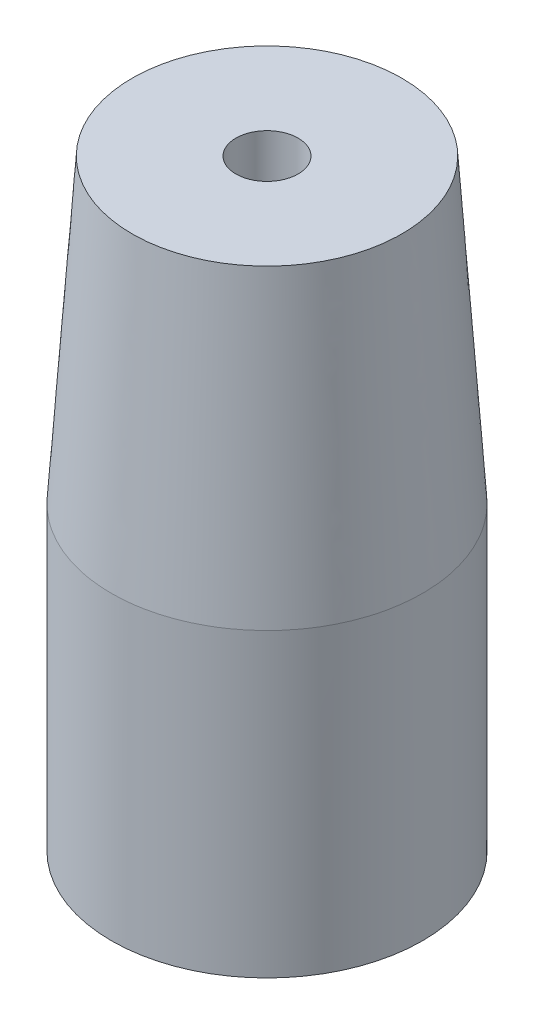
ISO-10303-21;
HEADER;
FILE_DESCRIPTION(('STEP AP214'),'2;1');
FILE_NAME('part.step','',(''),(''),'','','');
FILE_SCHEMA(('AUTOMOTIVE_DESIGN { 1 0 10303 214 1 1 1 1 }'));
ENDSEC;
DATA;
#1=APPLICATION_CONTEXT('core data for automotive mechanical design processes');
#2=APPLICATION_PROTOCOL_DEFINITION('international standard','automotive_design',2000,#1);
#3=PRODUCT_CONTEXT('',#1,'mechanical');
#4=PRODUCT('Part','Part','',(#3));
#5=PRODUCT_RELATED_PRODUCT_CATEGORY('part','',(#4));
#6=PRODUCT_DEFINITION_FORMATION('','',#4);
#7=PRODUCT_DEFINITION_CONTEXT('part definition',#1,'design');
#8=PRODUCT_DEFINITION('design','',#6,#7);
#9=PRODUCT_DEFINITION_SHAPE('','',#8);
#10=(LENGTH_UNIT() NAMED_UNIT(*) SI_UNIT(.MILLI.,.METRE.));
#11=(NAMED_UNIT(*) PLANE_ANGLE_UNIT() SI_UNIT($,.RADIAN.));
#12=(NAMED_UNIT(*) SI_UNIT($,.STERADIAN.) SOLID_ANGLE_UNIT());
#13=UNCERTAINTY_MEASURE_WITH_UNIT(LENGTH_MEASURE(1.E-05),#10,'distance_accuracy_value','');
#14=(GEOMETRIC_REPRESENTATION_CONTEXT(3) GLOBAL_UNCERTAINTY_ASSIGNED_CONTEXT((#13)) GLOBAL_UNIT_ASSIGNED_CONTEXT((#10,
#11,#12)) REPRESENTATION_CONTEXT('',''));
#15=CARTESIAN_POINT('',(0.,0.,0.));
#16=DIRECTION('',(0.,0.,1.));
#17=DIRECTION('',(1.,0.,0.));
#18=AXIS2_PLACEMENT_3D('',#15,#16,#17);
#19=CARTESIAN_POINT('',(0.,58.,-13.));
#20=CARTESIAN_POINT('',(-1.70169601901627,58.,-13.));
#21=CARTESIAN_POINT('',(-3.40272249822104,58.,-12.6616447960457));
#22=CARTESIAN_POINT('',(-6.54704674327126,58.,-11.3592230492478));
#23=CARTESIAN_POINT('',(-7.98910736086065,58.,-10.3956689499896));
#24=CARTESIAN_POINT('',(-10.3956689499896,58.,-7.98910736086063));
#25=CARTESIAN_POINT('',(-11.3592230492496,58.,-6.54704674326676));
#26=CARTESIAN_POINT('',(-12.6616447960438,58.,-3.40272249822562));
#27=CARTESIAN_POINT('',(-13.,58.,-1.70169601901135));
#28=CARTESIAN_POINT('',(-13.,58.,1.70169601901137));
#29=CARTESIAN_POINT('',(-12.6616447960482,58.,3.40272249821674));
#30=CARTESIAN_POINT('',(-11.3592230492452,58.,6.5470467432756));
#31=CARTESIAN_POINT('',(-10.3956689499861,58.,7.9891073608656));
#32=CARTESIAN_POINT('',(-7.98910736086411,58.,10.3956689499847));
#33=CARTESIAN_POINT('',(-6.54704674327559,58.,11.3592230492467));
#34=CARTESIAN_POINT('',(-3.40272249821674,58.,12.6616447960468));
#35=CARTESIAN_POINT('',(-1.70169601902153,58.,13.));
#36=CARTESIAN_POINT('',(1.70169601902153,58.,13.));
#37=CARTESIAN_POINT('',(3.40272249822191,58.,12.6616447960453));
#38=CARTESIAN_POINT('',(6.54704674327043,58.,11.3592230492482));
#39=CARTESIAN_POINT('',(7.98910736085969,58.,10.3956689499891));
#40=CARTESIAN_POINT('',(10.3956689499906,58.,7.98910736086116));
#41=CARTESIAN_POINT('',(11.3592230492482,58.,6.54704674327116));
#42=CARTESIAN_POINT('',(12.6616447960453,58.,3.40272249822116));
#43=CARTESIAN_POINT('',(13.,58.,1.70169601901627));
#44=CARTESIAN_POINT('',(13.,58.,-1.70169601901627));
#45=CARTESIAN_POINT('',(12.6616447960468,58.,-3.40272249822117));
#46=CARTESIAN_POINT('',(11.3592230492467,58.,-6.54704674327117));
#47=CARTESIAN_POINT('',(10.3956689499896,58.,-7.98910736085917));
#48=CARTESIAN_POINT('',(7.98910736086063,58.,-10.3956689499911));
#49=CARTESIAN_POINT('',(6.54704674327129,58.,-11.3592230492492));
#50=CARTESIAN_POINT('',(3.40272249822108,58.,-12.6616447960442));
#51=CARTESIAN_POINT('',(1.70169601901627,58.,-13.));
#52=CARTESIAN_POINT('',(0.,58.,-13.));
#53=CARTESIAN_POINT('',(0.,29.,-15.));
#54=CARTESIAN_POINT('',(-1.96349540655723,29.,-15.));
#55=CARTESIAN_POINT('',(-3.92621826717803,29.,-14.6095901492838));
#56=CARTESIAN_POINT('',(-7.55428470377462,29.,-13.1067958260548));
#57=CARTESIAN_POINT('',(-9.21820080099237,29.,-11.9950026346041));
#58=CARTESIAN_POINT('',(-11.9950026346041,29.,-9.21820080099236));
#59=CARTESIAN_POINT('',(-13.106795826057,29.,-7.55428470376942));
#60=CARTESIAN_POINT('',(-14.6095901492816,29.,-3.92621826718332));
#61=CARTESIAN_POINT('',(-15.,29.,-1.96349540655156));
#62=CARTESIAN_POINT('',(-15.,29.,1.96349540655158));
#63=CARTESIAN_POINT('',(-14.6095901492859,29.,3.92621826717291));
#64=CARTESIAN_POINT('',(-13.1067958260527,29.,7.55428470377979));
#65=CARTESIAN_POINT('',(-11.9950026345986,29.,9.21820080099786));
#66=CARTESIAN_POINT('',(-9.21820080099784,29.,11.9950026345986));
#67=CARTESIAN_POINT('',(-7.55428470377926,29.,13.1067958260529));
#68=CARTESIAN_POINT('',(-3.92621826717343,29.,14.6095901492857));
#69=CARTESIAN_POINT('',(-1.96349540656331,29.,15.));
#70=CARTESIAN_POINT('',(1.96349540656331,29.,15.));
#71=CARTESIAN_POINT('',(3.92621826717951,29.,14.6095901492832));
#72=CARTESIAN_POINT('',(7.55428470377318,29.,13.1067958260554));
#73=CARTESIAN_POINT('',(9.21820080099269,29.,11.9950026346037));
#74=CARTESIAN_POINT('',(11.9950026346037,29.,9.21820080099269));
#75=CARTESIAN_POINT('',(13.106795826055,29.,7.55428470377433));
#76=CARTESIAN_POINT('',(14.6095901492836,29.,3.92621826717836));
#77=CARTESIAN_POINT('',(15.,29.,1.96349540655724));
#78=CARTESIAN_POINT('',(15.,29.,-1.96349540655723));
#79=CARTESIAN_POINT('',(14.6095901492839,29.,-3.92621826717784));
#80=CARTESIAN_POINT('',(13.1067958260547,29.,-7.55428470377486));
#81=CARTESIAN_POINT('',(11.9950026346048,29.,-9.21820080099164));
#82=CARTESIAN_POINT('',(9.21820080099162,29.,-11.9950026346048));
#83=CARTESIAN_POINT('',(7.55428470377414,29.,-13.106795826055));
#84=CARTESIAN_POINT('',(3.9262182671786,29.,-14.6095901492835));
#85=CARTESIAN_POINT('',(1.96349540655724,29.,-15.));
#86=CARTESIAN_POINT('',(0.,29.,-15.));
#87=B_SPLINE_SURFACE_WITH_KNOTS('',1,3,((#19,#20,#21,#22,#23,#24,#25,#26,#27,#28,#29,#30,#31,
#32,#33,#34,#35,#36,#37,#38,#39,#40,#41,#42,#43,#44,#45,#46,#47,#48,#49,#50,#51,#52),(#53,#54,
#55,#56,#57,#58,#59,#60,#61,#62,#63,#64,#65,#66,#67,#68,#69,#70,#71,#72,#73,#74,#75,#76,#77,#78,
#79,#80,#81,#82,#83,#84,#85,#86)),.UNSPECIFIED.,.F.,.T.,.F.,(2,2),(4,2,2,2,2,2,2,2,2,2,2,2,2,2,
2,2,4),(0.,1.),(-3.14159265358979,-2.74889357189107,-2.35619449019234,-1.96349540849362,
-1.5707963267949,-1.17809724509617,-0.785398163397448,-0.392699081698724,0.,0.392699081698724,
0.785398163397448,1.17809724509617,1.5707963267949,1.96349540849362,2.35619449019234,
2.74889357189107,3.14159265358979),.UNSPECIFIED.);
#88=CARTESIAN_POINT('',(0.,58.,-13.));
#89=CARTESIAN_POINT('',(1.70169601901627,58.,-13.));
#90=CARTESIAN_POINT('',(3.40272249822108,58.,-12.6616447960442));
#91=CARTESIAN_POINT('',(6.54704674327129,58.,-11.3592230492492));
#92=CARTESIAN_POINT('',(7.98910736086063,58.,-10.3956689499911));
#93=CARTESIAN_POINT('',(10.3956689499896,58.,-7.98910736085917));
#94=CARTESIAN_POINT('',(11.3592230492467,58.,-6.54704674327117));
#95=CARTESIAN_POINT('',(12.6616447960468,58.,-3.40272249822117));
#96=CARTESIAN_POINT('',(13.,58.,-1.70169601901627));
#97=CARTESIAN_POINT('',(13.,58.,1.70169601901627));
#98=CARTESIAN_POINT('',(12.6616447960453,58.,3.40272249822116));
#99=CARTESIAN_POINT('',(11.3592230492482,58.,6.54704674327116));
#100=CARTESIAN_POINT('',(10.3956689499906,58.,7.98910736086116));
#101=CARTESIAN_POINT('',(7.98910736085969,58.,10.3956689499891));
#102=CARTESIAN_POINT('',(6.54704674327043,58.,11.3592230492482));
#103=CARTESIAN_POINT('',(3.40272249822191,58.,12.6616447960453));
#104=CARTESIAN_POINT('',(1.70169601902153,58.,13.));
#105=CARTESIAN_POINT('',(-1.70169601902153,58.,13.));
#106=CARTESIAN_POINT('',(-3.40272249821674,58.,12.6616447960468));
#107=CARTESIAN_POINT('',(-6.54704674327559,58.,11.3592230492467));
#108=CARTESIAN_POINT('',(-7.98910736086411,58.,10.3956689499847));
#109=CARTESIAN_POINT('',(-10.3956689499861,58.,7.9891073608656));
#110=CARTESIAN_POINT('',(-11.3592230492452,58.,6.5470467432756));
#111=CARTESIAN_POINT('',(-12.6616447960482,58.,3.40272249821674));
#112=CARTESIAN_POINT('',(-13.,58.,1.70169601901137));
#113=CARTESIAN_POINT('',(-13.,58.,-1.70169601901135));
#114=CARTESIAN_POINT('',(-12.6616447960438,58.,-3.40272249822562));
#115=CARTESIAN_POINT('',(-11.3592230492496,58.,-6.54704674326676));
#116=CARTESIAN_POINT('',(-10.3956689499896,58.,-7.98910736086063));
#117=CARTESIAN_POINT('',(-7.98910736086065,58.,-10.3956689499896));
#118=CARTESIAN_POINT('',(-6.54704674327126,58.,-11.3592230492478));
#119=CARTESIAN_POINT('',(-3.40272249822104,58.,-12.6616447960457));
#120=CARTESIAN_POINT('',(-1.70169601901627,58.,-13.));
#121=CARTESIAN_POINT('',(0.,58.,-13.));
#122=B_SPLINE_CURVE_WITH_KNOTS('',3,(#88,#89,#90,#91,#92,#93,#94,#95,#96,#97,#98,#99,#100,#101,
#102,#103,#104,#105,#106,#107,#108,#109,#110,#111,#112,#113,#114,#115,#116,#117,#118,#119,#120,
#121),.UNSPECIFIED.,.T.,.F.,(4,2,2,2,2,2,2,2,2,2,2,2,2,2,2,2,4),(-3.14159265358979,
-2.74889357189107,-2.35619449019234,-1.96349540849362,-1.5707963267949,-1.17809724509617,
-0.785398163397448,-0.392699081698724,0.,0.392699081698724,0.785398163397448,1.17809724509617,
1.5707963267949,1.96349540849362,2.35619449019234,2.74889357189107,3.14159265358979),.UNSPECIFIED.);
#123=CARTESIAN_POINT('',(0.,58.,-13.));
#124=VERTEX_POINT('',#123);
#125=EDGE_CURVE('E47',#124,#124,#122,.F.);
#126=CARTESIAN_POINT('',(0.,29.,-15.));
#127=CARTESIAN_POINT('',(-1.96349540655723,29.,-15.));
#128=CARTESIAN_POINT('',(-3.92621826717803,29.,-14.6095901492838));
#129=CARTESIAN_POINT('',(-7.55428470377462,29.,-13.1067958260548));
#130=CARTESIAN_POINT('',(-9.21820080099237,29.,-11.9950026346041));
#131=CARTESIAN_POINT('',(-11.9950026346041,29.,-9.21820080099236));
#132=CARTESIAN_POINT('',(-13.106795826057,29.,-7.55428470376942));
#133=CARTESIAN_POINT('',(-14.6095901492816,29.,-3.92621826718332));
#134=CARTESIAN_POINT('',(-15.,29.,-1.96349540655156));
#135=CARTESIAN_POINT('',(-15.,29.,1.96349540655158));
#136=CARTESIAN_POINT('',(-14.6095901492859,29.,3.92621826717291));
#137=CARTESIAN_POINT('',(-13.1067958260527,29.,7.55428470377979));
#138=CARTESIAN_POINT('',(-11.9950026345986,29.,9.21820080099786));
#139=CARTESIAN_POINT('',(-9.21820080099784,29.,11.9950026345986));
#140=CARTESIAN_POINT('',(-7.55428470377926,29.,13.1067958260529));
#141=CARTESIAN_POINT('',(-3.92621826717343,29.,14.6095901492857));
#142=CARTESIAN_POINT('',(-1.96349540656331,29.,15.));
#143=CARTESIAN_POINT('',(1.96349540656331,29.,15.));
#144=CARTESIAN_POINT('',(3.92621826717951,29.,14.6095901492832));
#145=CARTESIAN_POINT('',(7.55428470377318,29.,13.1067958260554));
#146=CARTESIAN_POINT('',(9.21820080099269,29.,11.9950026346037));
#147=CARTESIAN_POINT('',(11.9950026346037,29.,9.21820080099269));
#148=CARTESIAN_POINT('',(13.106795826055,29.,7.55428470377433));
#149=CARTESIAN_POINT('',(14.6095901492836,29.,3.92621826717836));
#150=CARTESIAN_POINT('',(15.,29.,1.96349540655724));
#151=CARTESIAN_POINT('',(15.,29.,-1.96349540655723));
#152=CARTESIAN_POINT('',(14.6095901492839,29.,-3.92621826717784));
#153=CARTESIAN_POINT('',(13.1067958260547,29.,-7.55428470377486));
#154=CARTESIAN_POINT('',(11.9950026346048,29.,-9.21820080099164));
#155=CARTESIAN_POINT('',(9.21820080099162,29.,-11.9950026346048));
#156=CARTESIAN_POINT('',(7.55428470377414,29.,-13.106795826055));
#157=CARTESIAN_POINT('',(3.9262182671786,29.,-14.6095901492835));
#158=CARTESIAN_POINT('',(1.96349540655724,29.,-15.));
#159=CARTESIAN_POINT('',(0.,29.,-15.));
#160=B_SPLINE_CURVE_WITH_KNOTS('',3,(#126,#127,#128,#129,#130,#131,#132,#133,#134,#135,#136,
#137,#138,#139,#140,#141,#142,#143,#144,#145,#146,#147,#148,#149,#150,#151,#152,#153,#154,#155,
#156,#157,#158,#159),.UNSPECIFIED.,.T.,.F.,(4,2,2,2,2,2,2,2,2,2,2,2,2,2,2,2,4),
(-3.14159265358979,-2.74889357189107,-2.35619449019234,-1.96349540849362,-1.5707963267949,
-1.17809724509617,-0.785398163397448,-0.392699081698724,0.,0.392699081698724,0.785398163397448,
1.17809724509617,1.5707963267949,1.96349540849362,2.35619449019234,2.74889357189107,
3.14159265358979),.UNSPECIFIED.);
#161=CARTESIAN_POINT('',(0.,29.,-15.));
#162=VERTEX_POINT('',#161);
#163=EDGE_CURVE('E12',#162,#162,#160,.F.);
#164=ORIENTED_EDGE('',*,*,#125,.F.);
#165=EDGE_LOOP('',(#164));
#166=FACE_BOUND('',#165,.T.);
#167=ORIENTED_EDGE('',*,*,#163,.F.);
#168=EDGE_LOOP('',(#167));
#169=FACE_BOUND('',#168,.T.);
#170=ADVANCED_FACE('F36',(#166,#169),#87,.T.);
#171=CARTESIAN_POINT('',(0.,58.,0.));
#172=DIRECTION('',(0.,-1.,0.));
#173=DIRECTION('',(0.,0.,-1.));
#174=AXIS2_PLACEMENT_3D('',#171,#172,#173);
#175=CYLINDRICAL_SURFACE('',#174,15.);
#176=ORIENTED_EDGE('',*,*,#163,.T.);
#177=EDGE_LOOP('',(#176));
#178=FACE_BOUND('',#177,.T.);
#179=CARTESIAN_POINT('',(0.,0.,0.));
#180=DIRECTION('',(0.,1.,0.));
#181=DIRECTION('',(0.,0.,1.));
#182=AXIS2_PLACEMENT_3D('',#179,#180,#181);
#183=CIRCLE('',#182,15.);
#184=CARTESIAN_POINT('',(0.,0.,15.));
#185=VERTEX_POINT('',#184);
#186=EDGE_CURVE('E52',#185,#185,#183,.T.);
#187=ORIENTED_EDGE('',*,*,#186,.T.);
#188=EDGE_LOOP('',(#187));
#189=FACE_BOUND('',#188,.T.);
#190=ADVANCED_FACE('F81',(#178,#189),#175,.T.);
#191=CARTESIAN_POINT('',(0.,58.,0.));
#192=DIRECTION('',(0.,1.,0.));
#193=DIRECTION('',(0.,0.,1.));
#194=AXIS2_PLACEMENT_3D('',#191,#192,#193);
#195=PLANE('',#194);
#196=CARTESIAN_POINT('',(0.,58.,0.));
#197=DIRECTION('',(0.,1.,0.));
#198=DIRECTION('',(0.,0.,1.));
#199=AXIS2_PLACEMENT_3D('',#196,#197,#198);
#200=CIRCLE('',#199,3.);
#201=CARTESIAN_POINT('',(0.,58.,3.));
#202=VERTEX_POINT('',#201);
#203=EDGE_CURVE('E62',#202,#202,#200,.T.);
#204=ORIENTED_EDGE('',*,*,#203,.F.);
#205=EDGE_LOOP('',(#204));
#206=FACE_BOUND('',#205,.T.);
#207=ORIENTED_EDGE('',*,*,#125,.T.);
#208=EDGE_LOOP('',(#207));
#209=FACE_BOUND('',#208,.T.);
#210=ADVANCED_FACE('F70',(#206,#209),#195,.T.);
#211=CARTESIAN_POINT('',(0.,0.,0.));
#212=DIRECTION('',(0.,1.,0.));
#213=DIRECTION('',(0.,0.,1.));
#214=AXIS2_PLACEMENT_3D('',#211,#212,#213);
#215=PLANE('',#214);
#216=CARTESIAN_POINT('',(0.,0.,0.));
#217=DIRECTION('',(0.,1.,0.));
#218=DIRECTION('',(0.,0.,1.));
#219=AXIS2_PLACEMENT_3D('',#216,#217,#218);
#220=CIRCLE('',#219,3.);
#221=CARTESIAN_POINT('',(0.,0.,3.));
#222=VERTEX_POINT('',#221);
#223=EDGE_CURVE('E57',#222,#222,#220,.T.);
#224=ORIENTED_EDGE('',*,*,#223,.T.);
#225=EDGE_LOOP('',(#224));
#226=FACE_BOUND('',#225,.T.);
#227=ORIENTED_EDGE('',*,*,#186,.F.);
#228=EDGE_LOOP('',(#227));
#229=FACE_BOUND('',#228,.T.);
#230=ADVANCED_FACE('F80',(#226,#229),#215,.F.);
#231=CARTESIAN_POINT('',(0.,0.,0.));
#232=DIRECTION('',(0.,1.,0.));
#233=DIRECTION('',(0.,0.,1.));
#234=AXIS2_PLACEMENT_3D('',#231,#232,#233);
#235=CYLINDRICAL_SURFACE('',#234,3.);
#236=CARTESIAN_POINT('',(0.,0.,3.));
#237=CARTESIAN_POINT('',(0.,0.604166666666666,3.));
#238=CARTESIAN_POINT('',(0.,1.20833333333333,3.));
#239=CARTESIAN_POINT('',(0.,2.41666666666667,3.));
#240=CARTESIAN_POINT('',(0.,3.02083333333333,3.));
#241=CARTESIAN_POINT('',(0.,4.22916666666667,3.));
#242=CARTESIAN_POINT('',(0.,4.83333333333333,3.));
#243=CARTESIAN_POINT('',(0.,6.04166666666667,3.));
#244=CARTESIAN_POINT('',(0.,6.64583333333333,3.));
#245=CARTESIAN_POINT('',(0.,7.85416666666667,3.));
#246=CARTESIAN_POINT('',(0.,8.45833333333333,3.));
#247=CARTESIAN_POINT('',(0.,9.66666666666667,3.));
#248=CARTESIAN_POINT('',(0.,10.2708333333333,3.));
#249=CARTESIAN_POINT('',(0.,11.4791666666667,3.));
#250=CARTESIAN_POINT('',(0.,12.0833333333333,3.));
#251=CARTESIAN_POINT('',(0.,13.2916666666667,3.));
#252=CARTESIAN_POINT('',(0.,13.8958333333333,3.));
#253=CARTESIAN_POINT('',(0.,15.1041666666667,3.));
#254=CARTESIAN_POINT('',(0.,15.7083333333333,3.));
#255=CARTESIAN_POINT('',(0.,16.9166666666667,3.));
#256=CARTESIAN_POINT('',(0.,17.5208333333333,3.));
#257=CARTESIAN_POINT('',(0.,18.7291666666667,3.));
#258=CARTESIAN_POINT('',(0.,19.3333333333333,3.));
#259=CARTESIAN_POINT('',(0.,20.5416666666667,3.));
#260=CARTESIAN_POINT('',(0.,21.1458333333333,3.));
#261=CARTESIAN_POINT('',(0.,22.3541666666667,3.));
#262=CARTESIAN_POINT('',(0.,22.9583333333333,3.));
#263=CARTESIAN_POINT('',(0.,24.1666666666667,3.));
#264=CARTESIAN_POINT('',(0.,24.7708333333333,3.));
#265=CARTESIAN_POINT('',(0.,25.9791666666667,3.));
#266=CARTESIAN_POINT('',(0.,26.5833333333333,3.));
#267=CARTESIAN_POINT('',(0.,27.7916666666667,3.));
#268=CARTESIAN_POINT('',(0.,28.3958333333333,3.));
#269=CARTESIAN_POINT('',(0.,29.6041666666667,3.));
#270=CARTESIAN_POINT('',(0.,30.2083333333333,3.));
#271=CARTESIAN_POINT('',(0.,31.4166666666667,3.));
#272=CARTESIAN_POINT('',(0.,32.0208333333333,3.));
#273=CARTESIAN_POINT('',(0.,33.2291666666667,3.));
#274=CARTESIAN_POINT('',(0.,33.8333333333333,3.));
#275=CARTESIAN_POINT('',(0.,35.0416666666667,3.));
#276=CARTESIAN_POINT('',(0.,35.6458333333333,3.));
#277=CARTESIAN_POINT('',(0.,36.8541666666667,3.));
#278=CARTESIAN_POINT('',(0.,37.4583333333333,3.));
#279=CARTESIAN_POINT('',(0.,38.6666666666667,3.));
#280=CARTESIAN_POINT('',(0.,39.2708333333333,3.));
#281=CARTESIAN_POINT('',(0.,40.4791666666667,3.));
#282=CARTESIAN_POINT('',(0.,41.0833333333333,3.));
#283=CARTESIAN_POINT('',(0.,42.2916666666667,3.));
#284=CARTESIAN_POINT('',(0.,42.8958333333333,3.));
#285=CARTESIAN_POINT('',(0.,44.1041666666667,3.));
#286=CARTESIAN_POINT('',(0.,44.7083333333333,3.));
#287=CARTESIAN_POINT('',(0.,45.9166666666667,3.));
#288=CARTESIAN_POINT('',(0.,46.5208333333333,3.));
#289=CARTESIAN_POINT('',(0.,47.7291666666667,3.));
#290=CARTESIAN_POINT('',(0.,48.3333333333333,3.));
#291=CARTESIAN_POINT('',(0.,49.5416666666667,3.));
#292=CARTESIAN_POINT('',(0.,50.1458333333333,3.));
#293=CARTESIAN_POINT('',(0.,51.3541666666667,3.));
#294=CARTESIAN_POINT('',(0.,51.9583333333333,3.));
#295=CARTESIAN_POINT('',(0.,53.1666666666667,3.));
#296=CARTESIAN_POINT('',(0.,53.7708333333333,3.));
#297=CARTESIAN_POINT('',(0.,54.9791666666667,3.));
#298=CARTESIAN_POINT('',(0.,55.5833333333333,3.));
#299=CARTESIAN_POINT('',(0.,56.7916666666667,3.));
#300=CARTESIAN_POINT('',(0.,57.3958333333333,3.));
#301=CARTESIAN_POINT('',(0.,58.,3.));
#302=B_SPLINE_CURVE_WITH_KNOTS('',3,(#236,#237,#238,#239,#240,#241,#242,#243,#244,#245,#246,
#247,#248,#249,#250,#251,#252,#253,#254,#255,#256,#257,#258,#259,#260,#261,#262,#263,#264,#265,
#266,#267,#268,#269,#270,#271,#272,#273,#274,#275,#276,#277,#278,#279,#280,#281,#282,#283,#284,
#285,#286,#287,#288,#289,#290,#291,#292,#293,#294,#295,#296,#297,#298,#299,#300,#301),
.UNSPECIFIED.,.F.,.F.,(4,2,2,2,2,2,2,2,2,2,2,2,2,2,2,2,2,2,2,2,2,2,2,2,2,2,2,2,2,2,2,2,4),(0.,
1.8125,3.625,5.4375,7.25,9.0625,10.875,12.6875,14.5,16.3125,18.125,19.9375,21.75,23.5625,25.375,
27.1875,29.,30.8125,32.625,34.4375,36.25,38.0625,39.875,41.6875,43.5,45.3125,47.125,48.9375,
50.75,52.5625,54.375,56.1875,58.),.UNSPECIFIED.);
#303=EDGE_CURVE('BSEAM83',#222,#202,#302,.T.);
#304=ORIENTED_EDGE('',*,*,#223,.F.);
#305=ORIENTED_EDGE('',*,*,#203,.T.);
#306=ORIENTED_EDGE('',*,*,#303,.T.);
#307=ORIENTED_EDGE('',*,*,#303,.F.);
#308=EDGE_LOOP('',(#304,#306,#305,#307));
#309=FACE_BOUND('',#308,.T.);
#310=ADVANCED_FACE('F83',(#309),#235,.F.);
#311=CLOSED_SHELL('',(#170,#190,#210,#230,#310));
#312=MANIFOLD_SOLID_BREP('B2',#311);
#313=ADVANCED_BREP_SHAPE_REPRESENTATION('',(#18,#312),#14);
#314=SHAPE_DEFINITION_REPRESENTATION(#9,#313);
ENDSEC;
END-ISO-10303-21;
